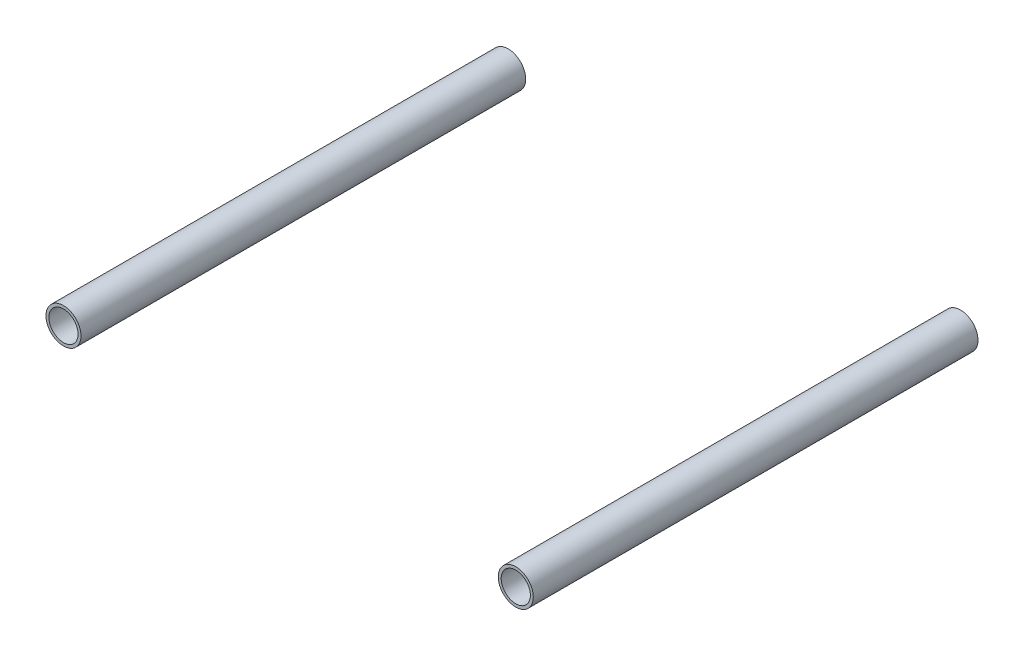
ISO-10303-21;
HEADER;
FILE_DESCRIPTION(('STEP AP214'),'2;1');
FILE_NAME('part.step','',(''),(''),'','','');
FILE_SCHEMA(('AUTOMOTIVE_DESIGN { 1 0 10303 214 1 1 1 1 }'));
ENDSEC;
DATA;
#1=APPLICATION_CONTEXT('core data for automotive mechanical design processes');
#2=APPLICATION_PROTOCOL_DEFINITION('international standard','automotive_design',2000,#1);
#3=PRODUCT_CONTEXT('',#1,'mechanical');
#4=PRODUCT('Part','Part','',(#3));
#5=PRODUCT_RELATED_PRODUCT_CATEGORY('part','',(#4));
#6=PRODUCT_DEFINITION_FORMATION('','',#4);
#7=PRODUCT_DEFINITION_CONTEXT('part definition',#1,'design');
#8=PRODUCT_DEFINITION('design','',#6,#7);
#9=PRODUCT_DEFINITION_SHAPE('','',#8);
#10=(LENGTH_UNIT() NAMED_UNIT(*) SI_UNIT(.MILLI.,.METRE.));
#11=(NAMED_UNIT(*) PLANE_ANGLE_UNIT() SI_UNIT($,.RADIAN.));
#12=(NAMED_UNIT(*) SI_UNIT($,.STERADIAN.) SOLID_ANGLE_UNIT());
#13=UNCERTAINTY_MEASURE_WITH_UNIT(LENGTH_MEASURE(1.E-05),#10,'distance_accuracy_value','');
#14=(GEOMETRIC_REPRESENTATION_CONTEXT(3) GLOBAL_UNCERTAINTY_ASSIGNED_CONTEXT((#13)) GLOBAL_UNIT_ASSIGNED_CONTEXT((#10,
#11,#12)) REPRESENTATION_CONTEXT('',''));
#15=CARTESIAN_POINT('',(0.,0.,0.));
#16=DIRECTION('',(0.,0.,1.));
#17=DIRECTION('',(1.,0.,0.));
#18=AXIS2_PLACEMENT_3D('',#15,#16,#17);
#19=CARTESIAN_POINT('',(77.5,0.,-76.2));
#20=DIRECTION('',(0.,0.,1.));
#21=DIRECTION('',(1.,0.,0.));
#22=AXIS2_PLACEMENT_3D('',#19,#20,#21);
#23=CYLINDRICAL_SURFACE('',#22,6.);
#24=CARTESIAN_POINT('',(77.5,0.,-76.2));
#25=DIRECTION('',(0.,0.,1.));
#26=DIRECTION('',(-1.,0.,0.));
#27=AXIS2_PLACEMENT_3D('',#24,#25,#26);
#28=CIRCLE('',#27,6.);
#29=CARTESIAN_POINT('',(83.5,0.,-76.2));
#30=VERTEX_POINT('',#29);
#31=EDGE_CURVE('E11',#30,#30,#28,.T.);
#32=CARTESIAN_POINT('',(77.5,0.,76.2));
#33=DIRECTION('',(0.,0.,1.));
#34=DIRECTION('',(-1.,0.,0.));
#35=AXIS2_PLACEMENT_3D('',#32,#33,#34);
#36=CIRCLE('',#35,6.);
#37=CARTESIAN_POINT('',(83.5,0.,76.2));
#38=VERTEX_POINT('',#37);
#39=EDGE_CURVE('E44',#38,#38,#36,.T.);
#40=CARTESIAN_POINT('',(83.5,0.,-76.2));
#41=CARTESIAN_POINT('',(83.5,0.,-74.6125));
#42=CARTESIAN_POINT('',(83.5,0.,-73.025));
#43=CARTESIAN_POINT('',(83.5,0.,-69.85));
#44=CARTESIAN_POINT('',(83.5,0.,-68.2625));
#45=CARTESIAN_POINT('',(83.5,0.,-65.0875));
#46=CARTESIAN_POINT('',(83.5,0.,-63.5));
#47=CARTESIAN_POINT('',(83.5,0.,-60.325));
#48=CARTESIAN_POINT('',(83.5,0.,-58.7375));
#49=CARTESIAN_POINT('',(83.5,0.,-55.5625));
#50=CARTESIAN_POINT('',(83.5,0.,-53.975));
#51=CARTESIAN_POINT('',(83.5,0.,-50.8));
#52=CARTESIAN_POINT('',(83.5,0.,-49.2125));
#53=CARTESIAN_POINT('',(83.5,0.,-46.0375));
#54=CARTESIAN_POINT('',(83.5,0.,-44.45));
#55=CARTESIAN_POINT('',(83.5,0.,-41.275));
#56=CARTESIAN_POINT('',(83.5,0.,-39.6875));
#57=CARTESIAN_POINT('',(83.5,0.,-36.5125));
#58=CARTESIAN_POINT('',(83.5,0.,-34.925));
#59=CARTESIAN_POINT('',(83.5,0.,-31.75));
#60=CARTESIAN_POINT('',(83.5,0.,-30.1625));
#61=CARTESIAN_POINT('',(83.5,0.,-26.9875));
#62=CARTESIAN_POINT('',(83.5,0.,-25.4));
#63=CARTESIAN_POINT('',(83.5,0.,-22.225));
#64=CARTESIAN_POINT('',(83.5,0.,-20.6375));
#65=CARTESIAN_POINT('',(83.5,0.,-17.4625));
#66=CARTESIAN_POINT('',(83.5,0.,-15.875));
#67=CARTESIAN_POINT('',(83.5,0.,-12.7));
#68=CARTESIAN_POINT('',(83.5,0.,-11.1125));
#69=CARTESIAN_POINT('',(83.5,0.,-7.93750000000002));
#70=CARTESIAN_POINT('',(83.5,0.,-6.35000000000002));
#71=CARTESIAN_POINT('',(83.5,0.,-3.17500000000002));
#72=CARTESIAN_POINT('',(83.5,0.,-1.58750000000001));
#73=CARTESIAN_POINT('',(83.5,0.,1.58749999999999));
#74=CARTESIAN_POINT('',(83.5,0.,3.17499999999999));
#75=CARTESIAN_POINT('',(83.5,0.,6.34999999999999));
#76=CARTESIAN_POINT('',(83.5,0.,7.93749999999999));
#77=CARTESIAN_POINT('',(83.5,0.,11.1125));
#78=CARTESIAN_POINT('',(83.5,0.,12.7));
#79=CARTESIAN_POINT('',(83.5,0.,15.875));
#80=CARTESIAN_POINT('',(83.5,0.,17.4625));
#81=CARTESIAN_POINT('',(83.5,0.,20.6375));
#82=CARTESIAN_POINT('',(83.5,0.,22.225));
#83=CARTESIAN_POINT('',(83.5,0.,25.4));
#84=CARTESIAN_POINT('',(83.5,0.,26.9875));
#85=CARTESIAN_POINT('',(83.5,0.,30.1625));
#86=CARTESIAN_POINT('',(83.5,0.,31.75));
#87=CARTESIAN_POINT('',(83.5,0.,34.925));
#88=CARTESIAN_POINT('',(83.5,0.,36.5125));
#89=CARTESIAN_POINT('',(83.5,0.,39.6875));
#90=CARTESIAN_POINT('',(83.5,0.,41.275));
#91=CARTESIAN_POINT('',(83.5,0.,44.45));
#92=CARTESIAN_POINT('',(83.5,0.,46.0375));
#93=CARTESIAN_POINT('',(83.5,0.,49.2125));
#94=CARTESIAN_POINT('',(83.5,0.,50.8));
#95=CARTESIAN_POINT('',(83.5,0.,53.975));
#96=CARTESIAN_POINT('',(83.5,0.,55.5625));
#97=CARTESIAN_POINT('',(83.5,0.,58.7375));
#98=CARTESIAN_POINT('',(83.5,0.,60.325));
#99=CARTESIAN_POINT('',(83.5,0.,63.5));
#100=CARTESIAN_POINT('',(83.5,0.,65.0875));
#101=CARTESIAN_POINT('',(83.5,0.,68.2625));
#102=CARTESIAN_POINT('',(83.5,0.,69.85));
#103=CARTESIAN_POINT('',(83.5,0.,73.025));
#104=CARTESIAN_POINT('',(83.5,0.,74.6125));
#105=CARTESIAN_POINT('',(83.5,0.,76.2));
#106=B_SPLINE_CURVE_WITH_KNOTS('',3,(#40,#41,#42,#43,#44,#45,#46,#47,#48,#49,#50,#51,#52,#53,
#54,#55,#56,#57,#58,#59,#60,#61,#62,#63,#64,#65,#66,#67,#68,#69,#70,#71,#72,#73,#74,#75,#76,#77,
#78,#79,#80,#81,#82,#83,#84,#85,#86,#87,#88,#89,#90,#91,#92,#93,#94,#95,#96,#97,#98,#99,#100,
#101,#102,#103,#104,#105),.UNSPECIFIED.,.F.,.F.,(4,2,2,2,2,2,2,2,2,2,2,2,2,2,2,2,2,2,2,2,2,2,2,
2,2,2,2,2,2,2,2,2,4),(0.,4.7625,9.52500000000001,14.2875,19.05,23.8125,28.575,33.3375,38.1,
42.8625,47.625,52.3875,57.15,61.9125,66.675,71.4375,76.2,80.9625,85.725,90.4875,95.25,100.0125,
104.775,109.5375,114.3,119.0625,123.825,128.5875,133.35,138.1125,142.875,147.6375,152.4),.UNSPECIFIED.);
#107=EDGE_CURVE('BSEAM41',#30,#38,#106,.T.);
#108=ORIENTED_EDGE('',*,*,#31,.T.);
#109=ORIENTED_EDGE('',*,*,#39,.F.);
#110=ORIENTED_EDGE('',*,*,#107,.T.);
#111=ORIENTED_EDGE('',*,*,#107,.F.);
#112=EDGE_LOOP('',(#108,#110,#109,#111));
#113=FACE_BOUND('',#112,.T.);
#114=ADVANCED_FACE('F41',(#113),#23,.T.);
#115=CARTESIAN_POINT('',(77.5,0.,-76.2));
#116=DIRECTION('',(0.,0.,-1.));
#117=DIRECTION('',(-1.,0.,0.));
#118=AXIS2_PLACEMENT_3D('',#115,#116,#117);
#119=PLANE('',#118);
#120=CARTESIAN_POINT('',(77.5,0.,-76.2));
#121=DIRECTION('',(0.,0.,1.));
#122=DIRECTION('',(-1.,0.,0.));
#123=AXIS2_PLACEMENT_3D('',#120,#121,#122);
#124=CIRCLE('',#123,5.);
#125=CARTESIAN_POINT('',(82.5,0.,-76.2));
#126=VERTEX_POINT('',#125);
#127=EDGE_CURVE('E51',#126,#126,#124,.T.);
#128=ORIENTED_EDGE('',*,*,#127,.T.);
#129=EDGE_LOOP('',(#128));
#130=FACE_BOUND('',#129,.T.);
#131=ORIENTED_EDGE('',*,*,#31,.F.);
#132=EDGE_LOOP('',(#131));
#133=FACE_BOUND('',#132,.T.);
#134=ADVANCED_FACE('F59',(#130,#133),#119,.T.);
#135=CARTESIAN_POINT('',(77.5,0.,76.2));
#136=DIRECTION('',(0.,0.,-1.));
#137=DIRECTION('',(-1.,0.,0.));
#138=AXIS2_PLACEMENT_3D('',#135,#136,#137);
#139=PLANE('',#138);
#140=CARTESIAN_POINT('',(77.5,0.,76.2));
#141=DIRECTION('',(0.,0.,1.));
#142=DIRECTION('',(-1.,0.,0.));
#143=AXIS2_PLACEMENT_3D('',#140,#141,#142);
#144=CIRCLE('',#143,5.);
#145=CARTESIAN_POINT('',(82.5,0.,76.2));
#146=VERTEX_POINT('',#145);
#147=EDGE_CURVE('E53',#146,#146,#144,.T.);
#148=ORIENTED_EDGE('',*,*,#147,.F.);
#149=EDGE_LOOP('',(#148));
#150=FACE_BOUND('',#149,.T.);
#151=ORIENTED_EDGE('',*,*,#39,.T.);
#152=EDGE_LOOP('',(#151));
#153=FACE_BOUND('',#152,.T.);
#154=ADVANCED_FACE('F65',(#150,#153),#139,.F.);
#155=CARTESIAN_POINT('',(77.5,0.,-76.2));
#156=DIRECTION('',(0.,0.,1.));
#157=DIRECTION('',(1.,0.,0.));
#158=AXIS2_PLACEMENT_3D('',#155,#156,#157);
#159=CYLINDRICAL_SURFACE('',#158,5.);
#160=CARTESIAN_POINT('',(82.5,0.,-76.2));
#161=CARTESIAN_POINT('',(82.5,0.,-74.6125));
#162=CARTESIAN_POINT('',(82.5,0.,-73.025));
#163=CARTESIAN_POINT('',(82.5,0.,-69.85));
#164=CARTESIAN_POINT('',(82.5,0.,-68.2625));
#165=CARTESIAN_POINT('',(82.5,0.,-65.0875));
#166=CARTESIAN_POINT('',(82.5,0.,-63.5));
#167=CARTESIAN_POINT('',(82.5,0.,-60.325));
#168=CARTESIAN_POINT('',(82.5,0.,-58.7375));
#169=CARTESIAN_POINT('',(82.5,0.,-55.5625));
#170=CARTESIAN_POINT('',(82.5,0.,-53.975));
#171=CARTESIAN_POINT('',(82.5,0.,-50.8));
#172=CARTESIAN_POINT('',(82.5,0.,-49.2125));
#173=CARTESIAN_POINT('',(82.5,0.,-46.0375));
#174=CARTESIAN_POINT('',(82.5,0.,-44.45));
#175=CARTESIAN_POINT('',(82.5,0.,-41.275));
#176=CARTESIAN_POINT('',(82.5,0.,-39.6875));
#177=CARTESIAN_POINT('',(82.5,0.,-36.5125));
#178=CARTESIAN_POINT('',(82.5,0.,-34.925));
#179=CARTESIAN_POINT('',(82.5,0.,-31.75));
#180=CARTESIAN_POINT('',(82.5,0.,-30.1625));
#181=CARTESIAN_POINT('',(82.5,0.,-26.9875));
#182=CARTESIAN_POINT('',(82.5,0.,-25.4));
#183=CARTESIAN_POINT('',(82.5,0.,-22.225));
#184=CARTESIAN_POINT('',(82.5,0.,-20.6375));
#185=CARTESIAN_POINT('',(82.5,0.,-17.4625));
#186=CARTESIAN_POINT('',(82.5,0.,-15.875));
#187=CARTESIAN_POINT('',(82.5,0.,-12.7));
#188=CARTESIAN_POINT('',(82.5,0.,-11.1125));
#189=CARTESIAN_POINT('',(82.5,0.,-7.93750000000002));
#190=CARTESIAN_POINT('',(82.5,0.,-6.35000000000002));
#191=CARTESIAN_POINT('',(82.5,0.,-3.17500000000002));
#192=CARTESIAN_POINT('',(82.5,0.,-1.58750000000001));
#193=CARTESIAN_POINT('',(82.5,0.,1.58749999999999));
#194=CARTESIAN_POINT('',(82.5,0.,3.17499999999999));
#195=CARTESIAN_POINT('',(82.5,0.,6.34999999999999));
#196=CARTESIAN_POINT('',(82.5,0.,7.93749999999999));
#197=CARTESIAN_POINT('',(82.5,0.,11.1125));
#198=CARTESIAN_POINT('',(82.5,0.,12.7));
#199=CARTESIAN_POINT('',(82.5,0.,15.875));
#200=CARTESIAN_POINT('',(82.5,0.,17.4625));
#201=CARTESIAN_POINT('',(82.5,0.,20.6375));
#202=CARTESIAN_POINT('',(82.5,0.,22.225));
#203=CARTESIAN_POINT('',(82.5,0.,25.4));
#204=CARTESIAN_POINT('',(82.5,0.,26.9875));
#205=CARTESIAN_POINT('',(82.5,0.,30.1625));
#206=CARTESIAN_POINT('',(82.5,0.,31.75));
#207=CARTESIAN_POINT('',(82.5,0.,34.925));
#208=CARTESIAN_POINT('',(82.5,0.,36.5125));
#209=CARTESIAN_POINT('',(82.5,0.,39.6875));
#210=CARTESIAN_POINT('',(82.5,0.,41.275));
#211=CARTESIAN_POINT('',(82.5,0.,44.45));
#212=CARTESIAN_POINT('',(82.5,0.,46.0375));
#213=CARTESIAN_POINT('',(82.5,0.,49.2125));
#214=CARTESIAN_POINT('',(82.5,0.,50.8));
#215=CARTESIAN_POINT('',(82.5,0.,53.975));
#216=CARTESIAN_POINT('',(82.5,0.,55.5625));
#217=CARTESIAN_POINT('',(82.5,0.,58.7375));
#218=CARTESIAN_POINT('',(82.5,0.,60.325));
#219=CARTESIAN_POINT('',(82.5,0.,63.5));
#220=CARTESIAN_POINT('',(82.5,0.,65.0875));
#221=CARTESIAN_POINT('',(82.5,0.,68.2625));
#222=CARTESIAN_POINT('',(82.5,0.,69.85));
#223=CARTESIAN_POINT('',(82.5,0.,73.025));
#224=CARTESIAN_POINT('',(82.5,0.,74.6125));
#225=CARTESIAN_POINT('',(82.5,0.,76.2));
#226=B_SPLINE_CURVE_WITH_KNOTS('',3,(#160,#161,#162,#163,#164,#165,#166,#167,#168,#169,#170,
#171,#172,#173,#174,#175,#176,#177,#178,#179,#180,#181,#182,#183,#184,#185,#186,#187,#188,#189,
#190,#191,#192,#193,#194,#195,#196,#197,#198,#199,#200,#201,#202,#203,#204,#205,#206,#207,#208,
#209,#210,#211,#212,#213,#214,#215,#216,#217,#218,#219,#220,#221,#222,#223,#224,#225),
.UNSPECIFIED.,.F.,.F.,(4,2,2,2,2,2,2,2,2,2,2,2,2,2,2,2,2,2,2,2,2,2,2,2,2,2,2,2,2,2,2,2,4),(0.,
4.7625,9.52500000000001,14.2875,19.05,23.8125,28.575,33.3375,38.1,42.8625,47.625,52.3875,57.15,
61.9125,66.675,71.4375,76.2,80.9625,85.725,90.4875,95.25,100.0125,104.775,109.5375,114.3,
119.0625,123.825,128.5875,133.35,138.1125,142.875,147.6375,152.4),.UNSPECIFIED.);
#227=EDGE_CURVE('BSEAM62',#126,#146,#226,.T.);
#228=ORIENTED_EDGE('',*,*,#127,.F.);
#229=ORIENTED_EDGE('',*,*,#147,.T.);
#230=ORIENTED_EDGE('',*,*,#227,.T.);
#231=ORIENTED_EDGE('',*,*,#227,.F.);
#232=EDGE_LOOP('',(#228,#230,#229,#231));
#233=FACE_BOUND('',#232,.T.);
#234=ADVANCED_FACE('F62',(#233),#159,.F.);
#235=CLOSED_SHELL('',(#114,#134,#154,#234));
#236=MANIFOLD_SOLID_BREP('B2',#235);
#237=CARTESIAN_POINT('',(-77.5,0.,-76.2));
#238=DIRECTION('',(0.,0.,1.));
#239=DIRECTION('',(1.,0.,0.));
#240=AXIS2_PLACEMENT_3D('',#237,#238,#239);
#241=CYLINDRICAL_SURFACE('',#240,6.);
#242=CARTESIAN_POINT('',(-77.5,0.,-76.2));
#243=DIRECTION('',(0.,0.,1.));
#244=DIRECTION('',(1.,0.,0.));
#245=AXIS2_PLACEMENT_3D('',#242,#243,#244);
#246=CIRCLE('',#245,6.);
#247=CARTESIAN_POINT('',(-71.5,0.,-76.2));
#248=VERTEX_POINT('',#247);
#249=EDGE_CURVE('E40',#248,#248,#246,.T.);
#250=CARTESIAN_POINT('',(-77.5,0.,76.2));
#251=DIRECTION('',(0.,0.,1.));
#252=DIRECTION('',(1.,0.,0.));
#253=AXIS2_PLACEMENT_3D('',#250,#251,#252);
#254=CIRCLE('',#253,6.);
#255=CARTESIAN_POINT('',(-71.5,0.,76.2));
#256=VERTEX_POINT('',#255);
#257=EDGE_CURVE('E106',#256,#256,#254,.T.);
#258=CARTESIAN_POINT('',(-71.5,0.,-76.2));
#259=CARTESIAN_POINT('',(-71.5,0.,-74.6125));
#260=CARTESIAN_POINT('',(-71.5,0.,-73.025));
#261=CARTESIAN_POINT('',(-71.5,0.,-69.85));
#262=CARTESIAN_POINT('',(-71.5,0.,-68.2625));
#263=CARTESIAN_POINT('',(-71.5,0.,-65.0875));
#264=CARTESIAN_POINT('',(-71.5,0.,-63.5));
#265=CARTESIAN_POINT('',(-71.5,0.,-60.325));
#266=CARTESIAN_POINT('',(-71.5,0.,-58.7375));
#267=CARTESIAN_POINT('',(-71.5,0.,-55.5625));
#268=CARTESIAN_POINT('',(-71.5,0.,-53.975));
#269=CARTESIAN_POINT('',(-71.5,0.,-50.8));
#270=CARTESIAN_POINT('',(-71.5,0.,-49.2125));
#271=CARTESIAN_POINT('',(-71.5,0.,-46.0375));
#272=CARTESIAN_POINT('',(-71.5,0.,-44.45));
#273=CARTESIAN_POINT('',(-71.5,0.,-41.275));
#274=CARTESIAN_POINT('',(-71.5,0.,-39.6875));
#275=CARTESIAN_POINT('',(-71.5,0.,-36.5125));
#276=CARTESIAN_POINT('',(-71.5,0.,-34.925));
#277=CARTESIAN_POINT('',(-71.5,0.,-31.75));
#278=CARTESIAN_POINT('',(-71.5,0.,-30.1625));
#279=CARTESIAN_POINT('',(-71.5,0.,-26.9875));
#280=CARTESIAN_POINT('',(-71.5,0.,-25.4));
#281=CARTESIAN_POINT('',(-71.5,0.,-22.225));
#282=CARTESIAN_POINT('',(-71.5,0.,-20.6375));
#283=CARTESIAN_POINT('',(-71.5,0.,-17.4625));
#284=CARTESIAN_POINT('',(-71.5,0.,-15.875));
#285=CARTESIAN_POINT('',(-71.5,0.,-12.7));
#286=CARTESIAN_POINT('',(-71.5,0.,-11.1125));
#287=CARTESIAN_POINT('',(-71.5,0.,-7.93750000000002));
#288=CARTESIAN_POINT('',(-71.5,0.,-6.35000000000002));
#289=CARTESIAN_POINT('',(-71.5,0.,-3.17500000000002));
#290=CARTESIAN_POINT('',(-71.5,0.,-1.58750000000001));
#291=CARTESIAN_POINT('',(-71.5,0.,1.58749999999999));
#292=CARTESIAN_POINT('',(-71.5,0.,3.17499999999999));
#293=CARTESIAN_POINT('',(-71.5,0.,6.34999999999999));
#294=CARTESIAN_POINT('',(-71.5,0.,7.93749999999999));
#295=CARTESIAN_POINT('',(-71.5,0.,11.1125));
#296=CARTESIAN_POINT('',(-71.5,0.,12.7));
#297=CARTESIAN_POINT('',(-71.5,0.,15.875));
#298=CARTESIAN_POINT('',(-71.5,0.,17.4625));
#299=CARTESIAN_POINT('',(-71.5,0.,20.6375));
#300=CARTESIAN_POINT('',(-71.5,0.,22.225));
#301=CARTESIAN_POINT('',(-71.5,0.,25.4));
#302=CARTESIAN_POINT('',(-71.5,0.,26.9875));
#303=CARTESIAN_POINT('',(-71.5,0.,30.1625));
#304=CARTESIAN_POINT('',(-71.5,0.,31.75));
#305=CARTESIAN_POINT('',(-71.5,0.,34.925));
#306=CARTESIAN_POINT('',(-71.5,0.,36.5125));
#307=CARTESIAN_POINT('',(-71.5,0.,39.6875));
#308=CARTESIAN_POINT('',(-71.5,0.,41.275));
#309=CARTESIAN_POINT('',(-71.5,0.,44.45));
#310=CARTESIAN_POINT('',(-71.5,0.,46.0375));
#311=CARTESIAN_POINT('',(-71.5,0.,49.2125));
#312=CARTESIAN_POINT('',(-71.5,0.,50.8));
#313=CARTESIAN_POINT('',(-71.5,0.,53.975));
#314=CARTESIAN_POINT('',(-71.5,0.,55.5625));
#315=CARTESIAN_POINT('',(-71.5,0.,58.7375));
#316=CARTESIAN_POINT('',(-71.5,0.,60.325));
#317=CARTESIAN_POINT('',(-71.5,0.,63.5));
#318=CARTESIAN_POINT('',(-71.5,0.,65.0875));
#319=CARTESIAN_POINT('',(-71.5,0.,68.2625));
#320=CARTESIAN_POINT('',(-71.5,0.,69.85));
#321=CARTESIAN_POINT('',(-71.5,0.,73.025));
#322=CARTESIAN_POINT('',(-71.5,0.,74.6125));
#323=CARTESIAN_POINT('',(-71.5,0.,76.2));
#324=B_SPLINE_CURVE_WITH_KNOTS('',3,(#258,#259,#260,#261,#262,#263,#264,#265,#266,#267,#268,
#269,#270,#271,#272,#273,#274,#275,#276,#277,#278,#279,#280,#281,#282,#283,#284,#285,#286,#287,
#288,#289,#290,#291,#292,#293,#294,#295,#296,#297,#298,#299,#300,#301,#302,#303,#304,#305,#306,
#307,#308,#309,#310,#311,#312,#313,#314,#315,#316,#317,#318,#319,#320,#321,#322,#323),
.UNSPECIFIED.,.F.,.F.,(4,2,2,2,2,2,2,2,2,2,2,2,2,2,2,2,2,2,2,2,2,2,2,2,2,2,2,2,2,2,2,2,4),(0.,
4.7625,9.52500000000001,14.2875,19.05,23.8125,28.575,33.3375,38.1,42.8625,47.625,52.3875,57.15,
61.9125,66.675,71.4375,76.2,80.9625,85.725,90.4875,95.25,100.0125,104.775,109.5375,114.3,
119.0625,123.825,128.5875,133.35,138.1125,142.875,147.6375,152.4),.UNSPECIFIED.);
#325=EDGE_CURVE('BSEAM103',#248,#256,#324,.T.);
#326=ORIENTED_EDGE('',*,*,#249,.T.);
#327=ORIENTED_EDGE('',*,*,#257,.F.);
#328=ORIENTED_EDGE('',*,*,#325,.T.);
#329=ORIENTED_EDGE('',*,*,#325,.F.);
#330=EDGE_LOOP('',(#326,#328,#327,#329));
#331=FACE_BOUND('',#330,.T.);
#332=ADVANCED_FACE('F103',(#331),#241,.T.);
#333=CARTESIAN_POINT('',(-77.5,0.,-76.2));
#334=DIRECTION('',(0.,0.,1.));
#335=DIRECTION('',(1.,0.,0.));
#336=AXIS2_PLACEMENT_3D('',#333,#334,#335);
#337=PLANE('',#336);
#338=CARTESIAN_POINT('',(-77.5,0.,-76.2));
#339=DIRECTION('',(0.,0.,1.));
#340=DIRECTION('',(1.,0.,0.));
#341=AXIS2_PLACEMENT_3D('',#338,#339,#340);
#342=CIRCLE('',#341,5.);
#343=CARTESIAN_POINT('',(-72.5,0.,-76.2));
#344=VERTEX_POINT('',#343);
#345=EDGE_CURVE('E114',#344,#344,#342,.T.);
#346=ORIENTED_EDGE('',*,*,#345,.T.);
#347=EDGE_LOOP('',(#346));
#348=FACE_BOUND('',#347,.T.);
#349=ORIENTED_EDGE('',*,*,#249,.F.);
#350=EDGE_LOOP('',(#349));
#351=FACE_BOUND('',#350,.T.);
#352=ADVANCED_FACE('F123',(#348,#351),#337,.F.);
#353=CARTESIAN_POINT('',(-77.5,0.,76.2));
#354=DIRECTION('',(0.,0.,1.));
#355=DIRECTION('',(1.,0.,0.));
#356=AXIS2_PLACEMENT_3D('',#353,#354,#355);
#357=PLANE('',#356);
#358=CARTESIAN_POINT('',(-77.5,0.,76.2));
#359=DIRECTION('',(0.,0.,1.));
#360=DIRECTION('',(1.,0.,0.));
#361=AXIS2_PLACEMENT_3D('',#358,#359,#360);
#362=CIRCLE('',#361,5.);
#363=CARTESIAN_POINT('',(-72.5,0.,76.2));
#364=VERTEX_POINT('',#363);
#365=EDGE_CURVE('E116',#364,#364,#362,.T.);
#366=ORIENTED_EDGE('',*,*,#365,.F.);
#367=EDGE_LOOP('',(#366));
#368=FACE_BOUND('',#367,.T.);
#369=ORIENTED_EDGE('',*,*,#257,.T.);
#370=EDGE_LOOP('',(#369));
#371=FACE_BOUND('',#370,.T.);
#372=ADVANCED_FACE('F129',(#368,#371),#357,.T.);
#373=CARTESIAN_POINT('',(-77.5,0.,-76.2));
#374=DIRECTION('',(0.,0.,1.));
#375=DIRECTION('',(1.,0.,0.));
#376=AXIS2_PLACEMENT_3D('',#373,#374,#375);
#377=CYLINDRICAL_SURFACE('',#376,5.);
#378=CARTESIAN_POINT('',(-72.5,0.,-76.2));
#379=CARTESIAN_POINT('',(-72.5,0.,-74.6125));
#380=CARTESIAN_POINT('',(-72.5,0.,-73.025));
#381=CARTESIAN_POINT('',(-72.5,0.,-69.85));
#382=CARTESIAN_POINT('',(-72.5,0.,-68.2625));
#383=CARTESIAN_POINT('',(-72.5,0.,-65.0875));
#384=CARTESIAN_POINT('',(-72.5,0.,-63.5));
#385=CARTESIAN_POINT('',(-72.5,0.,-60.325));
#386=CARTESIAN_POINT('',(-72.5,0.,-58.7375));
#387=CARTESIAN_POINT('',(-72.5,0.,-55.5625));
#388=CARTESIAN_POINT('',(-72.5,0.,-53.975));
#389=CARTESIAN_POINT('',(-72.5,0.,-50.8));
#390=CARTESIAN_POINT('',(-72.5,0.,-49.2125));
#391=CARTESIAN_POINT('',(-72.5,0.,-46.0375));
#392=CARTESIAN_POINT('',(-72.5,0.,-44.45));
#393=CARTESIAN_POINT('',(-72.5,0.,-41.275));
#394=CARTESIAN_POINT('',(-72.5,0.,-39.6875));
#395=CARTESIAN_POINT('',(-72.5,0.,-36.5125));
#396=CARTESIAN_POINT('',(-72.5,0.,-34.925));
#397=CARTESIAN_POINT('',(-72.5,0.,-31.75));
#398=CARTESIAN_POINT('',(-72.5,0.,-30.1625));
#399=CARTESIAN_POINT('',(-72.5,0.,-26.9875));
#400=CARTESIAN_POINT('',(-72.5,0.,-25.4));
#401=CARTESIAN_POINT('',(-72.5,0.,-22.225));
#402=CARTESIAN_POINT('',(-72.5,0.,-20.6375));
#403=CARTESIAN_POINT('',(-72.5,0.,-17.4625));
#404=CARTESIAN_POINT('',(-72.5,0.,-15.875));
#405=CARTESIAN_POINT('',(-72.5,0.,-12.7));
#406=CARTESIAN_POINT('',(-72.5,0.,-11.1125));
#407=CARTESIAN_POINT('',(-72.5,0.,-7.93750000000002));
#408=CARTESIAN_POINT('',(-72.5,0.,-6.35000000000002));
#409=CARTESIAN_POINT('',(-72.5,0.,-3.17500000000002));
#410=CARTESIAN_POINT('',(-72.5,0.,-1.58750000000001));
#411=CARTESIAN_POINT('',(-72.5,0.,1.58749999999999));
#412=CARTESIAN_POINT('',(-72.5,0.,3.17499999999999));
#413=CARTESIAN_POINT('',(-72.5,0.,6.34999999999999));
#414=CARTESIAN_POINT('',(-72.5,0.,7.93749999999999));
#415=CARTESIAN_POINT('',(-72.5,0.,11.1125));
#416=CARTESIAN_POINT('',(-72.5,0.,12.7));
#417=CARTESIAN_POINT('',(-72.5,0.,15.875));
#418=CARTESIAN_POINT('',(-72.5,0.,17.4625));
#419=CARTESIAN_POINT('',(-72.5,0.,20.6375));
#420=CARTESIAN_POINT('',(-72.5,0.,22.225));
#421=CARTESIAN_POINT('',(-72.5,0.,25.4));
#422=CARTESIAN_POINT('',(-72.5,0.,26.9875));
#423=CARTESIAN_POINT('',(-72.5,0.,30.1625));
#424=CARTESIAN_POINT('',(-72.5,0.,31.75));
#425=CARTESIAN_POINT('',(-72.5,0.,34.925));
#426=CARTESIAN_POINT('',(-72.5,0.,36.5125));
#427=CARTESIAN_POINT('',(-72.5,0.,39.6875));
#428=CARTESIAN_POINT('',(-72.5,0.,41.275));
#429=CARTESIAN_POINT('',(-72.5,0.,44.45));
#430=CARTESIAN_POINT('',(-72.5,0.,46.0375));
#431=CARTESIAN_POINT('',(-72.5,0.,49.2125));
#432=CARTESIAN_POINT('',(-72.5,0.,50.8));
#433=CARTESIAN_POINT('',(-72.5,0.,53.975));
#434=CARTESIAN_POINT('',(-72.5,0.,55.5625));
#435=CARTESIAN_POINT('',(-72.5,0.,58.7375));
#436=CARTESIAN_POINT('',(-72.5,0.,60.325));
#437=CARTESIAN_POINT('',(-72.5,0.,63.5));
#438=CARTESIAN_POINT('',(-72.5,0.,65.0875));
#439=CARTESIAN_POINT('',(-72.5,0.,68.2625));
#440=CARTESIAN_POINT('',(-72.5,0.,69.85));
#441=CARTESIAN_POINT('',(-72.5,0.,73.025));
#442=CARTESIAN_POINT('',(-72.5,0.,74.6125));
#443=CARTESIAN_POINT('',(-72.5,0.,76.2));
#444=B_SPLINE_CURVE_WITH_KNOTS('',3,(#378,#379,#380,#381,#382,#383,#384,#385,#386,#387,#388,
#389,#390,#391,#392,#393,#394,#395,#396,#397,#398,#399,#400,#401,#402,#403,#404,#405,#406,#407,
#408,#409,#410,#411,#412,#413,#414,#415,#416,#417,#418,#419,#420,#421,#422,#423,#424,#425,#426,
#427,#428,#429,#430,#431,#432,#433,#434,#435,#436,#437,#438,#439,#440,#441,#442,#443),
.UNSPECIFIED.,.F.,.F.,(4,2,2,2,2,2,2,2,2,2,2,2,2,2,2,2,2,2,2,2,2,2,2,2,2,2,2,2,2,2,2,2,4),(0.,
4.7625,9.52500000000001,14.2875,19.05,23.8125,28.575,33.3375,38.1,42.8625,47.625,52.3875,57.15,
61.9125,66.675,71.4375,76.2,80.9625,85.725,90.4875,95.25,100.0125,104.775,109.5375,114.3,
119.0625,123.825,128.5875,133.35,138.1125,142.875,147.6375,152.4),.UNSPECIFIED.);
#445=EDGE_CURVE('BSEAM126',#344,#364,#444,.T.);
#446=ORIENTED_EDGE('',*,*,#345,.F.);
#447=ORIENTED_EDGE('',*,*,#365,.T.);
#448=ORIENTED_EDGE('',*,*,#445,.T.);
#449=ORIENTED_EDGE('',*,*,#445,.F.);
#450=EDGE_LOOP('',(#446,#448,#447,#449));
#451=FACE_BOUND('',#450,.T.);
#452=ADVANCED_FACE('F126',(#451),#377,.F.);
#453=CLOSED_SHELL('',(#332,#352,#372,#452));
#454=MANIFOLD_SOLID_BREP('B6',#453);
#455=ADVANCED_BREP_SHAPE_REPRESENTATION('',(#18,#236,#454),#14);
#456=SHAPE_DEFINITION_REPRESENTATION(#9,#455);
ENDSEC;
END-ISO-10303-21;
